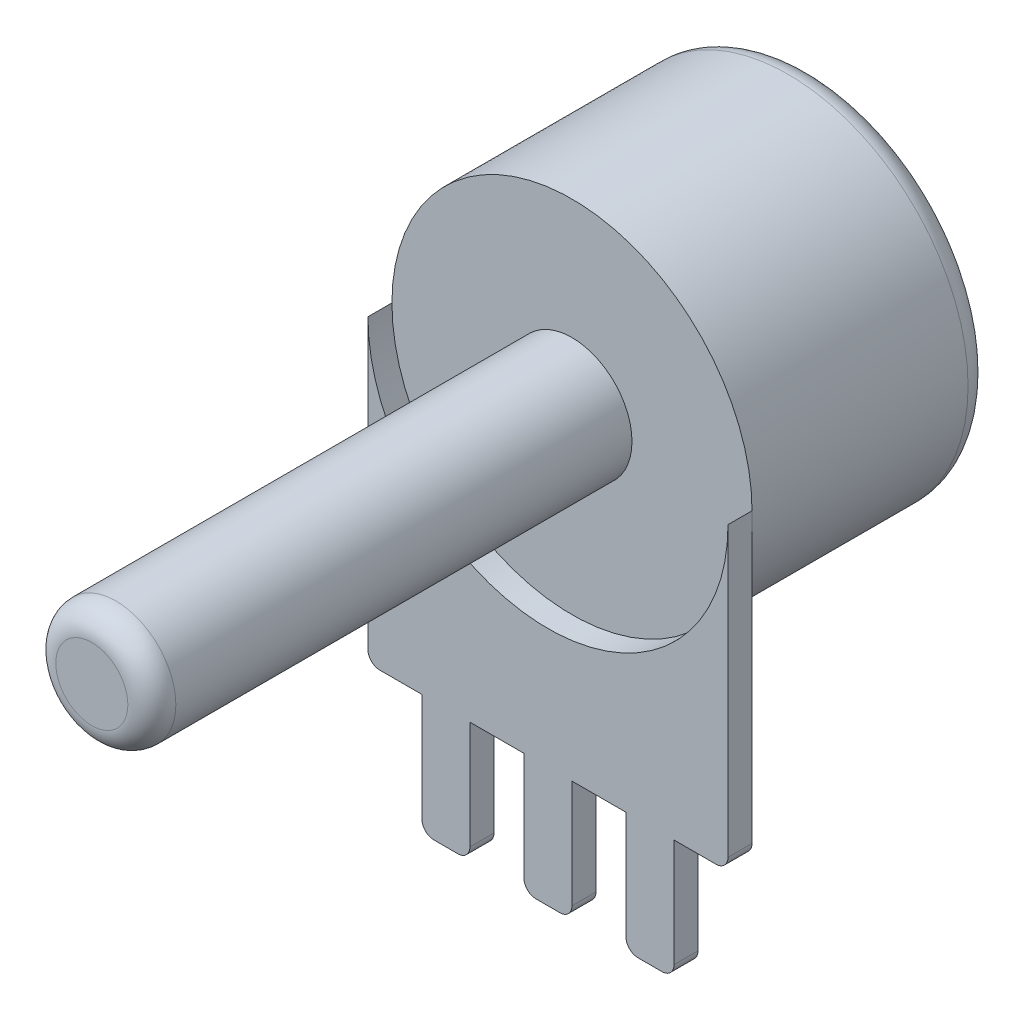
ISO-10303-21;
HEADER;
FILE_DESCRIPTION(('STEP AP214'),'2;1');
FILE_NAME('part.step','',(''),(''),'','','');
FILE_SCHEMA(('AUTOMOTIVE_DESIGN { 1 0 10303 214 1 1 1 1 }'));
ENDSEC;
DATA;
#1=APPLICATION_CONTEXT('core data for automotive mechanical design processes');
#2=APPLICATION_PROTOCOL_DEFINITION('international standard','automotive_design',2000,#1);
#3=PRODUCT_CONTEXT('',#1,'mechanical');
#4=PRODUCT('Part','Part','',(#3));
#5=PRODUCT_RELATED_PRODUCT_CATEGORY('part','',(#4));
#6=PRODUCT_DEFINITION_FORMATION('','',#4);
#7=PRODUCT_DEFINITION_CONTEXT('part definition',#1,'design');
#8=PRODUCT_DEFINITION('design','',#6,#7);
#9=PRODUCT_DEFINITION_SHAPE('','',#8);
#10=(LENGTH_UNIT() NAMED_UNIT(*) SI_UNIT(.MILLI.,.METRE.));
#11=(NAMED_UNIT(*) PLANE_ANGLE_UNIT() SI_UNIT($,.RADIAN.));
#12=(NAMED_UNIT(*) SI_UNIT($,.STERADIAN.) SOLID_ANGLE_UNIT());
#13=UNCERTAINTY_MEASURE_WITH_UNIT(LENGTH_MEASURE(1.E-05),#10,'distance_accuracy_value','');
#14=(GEOMETRIC_REPRESENTATION_CONTEXT(3) GLOBAL_UNCERTAINTY_ASSIGNED_CONTEXT((#13)) GLOBAL_UNIT_ASSIGNED_CONTEXT((#10,
#11,#12)) REPRESENTATION_CONTEXT('',''));
#15=CARTESIAN_POINT('',(0.,0.,0.));
#16=DIRECTION('',(0.,0.,1.));
#17=DIRECTION('',(1.,0.,0.));
#18=AXIS2_PLACEMENT_3D('',#15,#16,#17);
#19=CARTESIAN_POINT('',(0.,0.,11.));
#20=DIRECTION('',(0.,0.,-1.));
#21=DIRECTION('',(-1.,0.,0.));
#22=AXIS2_PLACEMENT_3D('',#19,#20,#21);
#23=CYLINDRICAL_SURFACE('',#22,7.5);
#24=CARTESIAN_POINT('',(0.,0.,10.));
#25=DIRECTION('',(0.,0.,-1.));
#26=DIRECTION('',(1.,0.,0.));
#27=AXIS2_PLACEMENT_3D('',#24,#25,#26);
#28=CIRCLE('',#27,7.5);
#29=CARTESIAN_POINT('',(7.5,0.,10.));
#30=VERTEX_POINT('',#29);
#31=CARTESIAN_POINT('',(-7.5,0.,10.));
#32=VERTEX_POINT('',#31);
#33=EDGE_CURVE('E231',#30,#32,#28,.T.);
#34=ORIENTED_EDGE('',*,*,#33,.T.);
#35=DIRECTION('',(0.,0.,-1.));
#36=VECTOR('',#35,1.);
#37=CARTESIAN_POINT('',(-7.5,0.,11.));
#38=LINE('',#37,#36);
#39=CARTESIAN_POINT('',(-7.5,0.,11.));
#40=VERTEX_POINT('',#39);
#41=EDGE_CURVE('E214',#40,#32,#38,.T.);
#42=ORIENTED_EDGE('',*,*,#41,.F.);
#43=CARTESIAN_POINT('',(0.,0.,11.));
#44=DIRECTION('',(0.,0.,-1.));
#45=DIRECTION('',(1.,0.,0.));
#46=AXIS2_PLACEMENT_3D('',#43,#44,#45);
#47=CIRCLE('',#46,7.5);
#48=CARTESIAN_POINT('',(7.5,0.,11.));
#49=VERTEX_POINT('',#48);
#50=EDGE_CURVE('E220',#49,#40,#47,.T.);
#51=ORIENTED_EDGE('',*,*,#50,.F.);
#52=DIRECTION('',(0.,0.,-1.));
#53=VECTOR('',#52,1.);
#54=CARTESIAN_POINT('',(7.5,0.,11.));
#55=LINE('',#54,#53);
#56=EDGE_CURVE('E362',#49,#30,#55,.T.);
#57=ORIENTED_EDGE('',*,*,#56,.T.);
#58=EDGE_LOOP('',(#34,#42,#51,#57));
#59=FACE_BOUND('',#58,.T.);
#60=ADVANCED_FACE('F47',(#59),#23,.F.);
#61=CARTESIAN_POINT('',(-7.5,-7.5,11.));
#62=DIRECTION('',(1.,0.,0.));
#63=DIRECTION('',(0.,1.,0.));
#64=AXIS2_PLACEMENT_3D('',#61,#62,#63);
#65=PLANE('',#64);
#66=DIRECTION('',(0.,-1.,0.));
#67=VECTOR('',#66,1.);
#68=CARTESIAN_POINT('',(-7.5,-7.5,10.));
#69=LINE('',#68,#67);
#70=CARTESIAN_POINT('',(-7.5,-12.,10.));
#71=VERTEX_POINT('',#70);
#72=EDGE_CURVE('E406',#32,#71,#69,.T.);
#73=ORIENTED_EDGE('',*,*,#72,.T.);
#74=DIRECTION('',(0.,0.,-1.));
#75=VECTOR('',#74,1.);
#76=CARTESIAN_POINT('',(-7.5,-12.,11.));
#77=LINE('',#76,#75);
#78=CARTESIAN_POINT('',(-7.5,-12.,11.));
#79=VERTEX_POINT('',#78);
#80=EDGE_CURVE('E217',#71,#79,#77,.F.);
#81=ORIENTED_EDGE('',*,*,#80,.T.);
#82=DIRECTION('',(0.,-1.,0.));
#83=VECTOR('',#82,1.);
#84=CARTESIAN_POINT('',(-7.5,0.,11.));
#85=LINE('',#84,#83);
#86=EDGE_CURVE('E209',#40,#79,#85,.T.);
#87=ORIENTED_EDGE('',*,*,#86,.F.);
#88=ORIENTED_EDGE('',*,*,#41,.T.);
#89=EDGE_LOOP('',(#73,#81,#87,#88));
#90=FACE_BOUND('',#89,.T.);
#91=ADVANCED_FACE('F212',(#90),#65,.F.);
#92=CARTESIAN_POINT('',(-7.5,-12.5,11.));
#93=DIRECTION('',(0.,1.,0.));
#94=DIRECTION('',(0.,0.,1.));
#95=AXIS2_PLACEMENT_3D('',#92,#93,#94);
#96=PLANE('',#95);
#97=DIRECTION('',(1.,0.,0.));
#98=VECTOR('',#97,1.);
#99=CARTESIAN_POINT('',(-7.5,-12.5,11.));
#100=LINE('',#99,#98);
#101=CARTESIAN_POINT('',(-7.,-12.5,11.));
#102=VERTEX_POINT('',#101);
#103=CARTESIAN_POINT('',(-5.25,-12.5,11.));
#104=VERTEX_POINT('',#103);
#105=EDGE_CURVE('E219',#102,#104,#100,.T.);
#106=ORIENTED_EDGE('',*,*,#105,.F.);
#107=DIRECTION('',(0.,0.,-1.));
#108=VECTOR('',#107,1.);
#109=CARTESIAN_POINT('',(-7.,-12.5,11.));
#110=LINE('',#109,#108);
#111=CARTESIAN_POINT('',(-7.,-12.5,10.));
#112=VERTEX_POINT('',#111);
#113=EDGE_CURVE('E232',#102,#112,#110,.T.);
#114=ORIENTED_EDGE('',*,*,#113,.T.);
#115=DIRECTION('',(1.,0.,0.));
#116=VECTOR('',#115,1.);
#117=CARTESIAN_POINT('',(-7.5,-12.5,10.));
#118=LINE('',#117,#116);
#119=CARTESIAN_POINT('',(-5.25,-12.5,10.));
#120=VERTEX_POINT('',#119);
#121=EDGE_CURVE('E408',#112,#120,#118,.T.);
#122=ORIENTED_EDGE('',*,*,#121,.T.);
#123=DIRECTION('',(0.,0.,-1.));
#124=VECTOR('',#123,1.);
#125=CARTESIAN_POINT('',(-5.25,-12.5,11.));
#126=LINE('',#125,#124);
#127=EDGE_CURVE('E233',#104,#120,#126,.T.);
#128=ORIENTED_EDGE('',*,*,#127,.F.);
#129=EDGE_LOOP('',(#106,#114,#122,#128));
#130=FACE_BOUND('',#129,.T.);
#131=ADVANCED_FACE('F427',(#130),#96,.F.);
#132=CARTESIAN_POINT('',(-5.25,-12.5,11.));
#133=DIRECTION('',(1.,0.,0.));
#134=DIRECTION('',(0.,1.,0.));
#135=AXIS2_PLACEMENT_3D('',#132,#133,#134);
#136=PLANE('',#135);
#137=DIRECTION('',(0.,-1.,0.));
#138=VECTOR('',#137,1.);
#139=CARTESIAN_POINT('',(-5.25,-12.5,10.));
#140=LINE('',#139,#138);
#141=CARTESIAN_POINT('',(-5.25,-17.,10.));
#142=VERTEX_POINT('',#141);
#143=EDGE_CURVE('E338',#120,#142,#140,.T.);
#144=ORIENTED_EDGE('',*,*,#143,.T.);
#145=DIRECTION('',(0.,0.,-1.));
#146=VECTOR('',#145,1.);
#147=CARTESIAN_POINT('',(-5.25,-17.,11.));
#148=LINE('',#147,#146);
#149=CARTESIAN_POINT('',(-5.25,-17.,11.));
#150=VERTEX_POINT('',#149);
#151=EDGE_CURVE('E12',#142,#150,#148,.F.);
#152=ORIENTED_EDGE('',*,*,#151,.T.);
#153=DIRECTION('',(0.,-1.,0.));
#154=VECTOR('',#153,1.);
#155=CARTESIAN_POINT('',(-5.25,-12.5,11.));
#156=LINE('',#155,#154);
#157=EDGE_CURVE('E319',#104,#150,#156,.T.);
#158=ORIENTED_EDGE('',*,*,#157,.F.);
#159=ORIENTED_EDGE('',*,*,#127,.T.);
#160=EDGE_LOOP('',(#144,#152,#158,#159));
#161=FACE_BOUND('',#160,.T.);
#162=ADVANCED_FACE('F413',(#161),#136,.F.);
#163=CARTESIAN_POINT('',(-5.25,-17.5,11.));
#164=DIRECTION('',(0.,1.,0.));
#165=DIRECTION('',(0.,0.,1.));
#166=AXIS2_PLACEMENT_3D('',#163,#164,#165);
#167=PLANE('',#166);
#168=DIRECTION('',(1.,0.,0.));
#169=VECTOR('',#168,1.);
#170=CARTESIAN_POINT('',(-5.25,-17.5,10.));
#171=LINE('',#170,#169);
#172=CARTESIAN_POINT('',(-4.75,-17.5,10.));
#173=VERTEX_POINT('',#172);
#174=CARTESIAN_POINT('',(-3.75,-17.5,10.));
#175=VERTEX_POINT('',#174);
#176=EDGE_CURVE('E312',#173,#175,#171,.T.);
#177=ORIENTED_EDGE('',*,*,#176,.T.);
#178=DIRECTION('',(0.,0.,-1.));
#179=VECTOR('',#178,1.);
#180=CARTESIAN_POINT('',(-3.75,-17.5,11.));
#181=LINE('',#180,#179);
#182=CARTESIAN_POINT('',(-3.75,-17.5,11.));
#183=VERTEX_POINT('',#182);
#184=EDGE_CURVE('E55',#175,#183,#181,.F.);
#185=ORIENTED_EDGE('',*,*,#184,.T.);
#186=DIRECTION('',(1.,0.,0.));
#187=VECTOR('',#186,1.);
#188=CARTESIAN_POINT('',(-5.25,-17.5,11.));
#189=LINE('',#188,#187);
#190=CARTESIAN_POINT('',(-4.75,-17.5,11.));
#191=VERTEX_POINT('',#190);
#192=EDGE_CURVE('E309',#191,#183,#189,.T.);
#193=ORIENTED_EDGE('',*,*,#192,.F.);
#194=DIRECTION('',(0.,0.,-1.));
#195=VECTOR('',#194,1.);
#196=CARTESIAN_POINT('',(-4.75,-17.5,11.));
#197=LINE('',#196,#195);
#198=EDGE_CURVE('E301',#191,#173,#197,.T.);
#199=ORIENTED_EDGE('',*,*,#198,.T.);
#200=EDGE_LOOP('',(#177,#185,#193,#199));
#201=FACE_BOUND('',#200,.T.);
#202=ADVANCED_FACE('F308',(#201),#167,.F.);
#203=CARTESIAN_POINT('',(-3.25,-17.5,11.));
#204=DIRECTION('',(-1.,0.,0.));
#205=DIRECTION('',(0.,-1.,0.));
#206=AXIS2_PLACEMENT_3D('',#203,#204,#205);
#207=PLANE('',#206);
#208=DIRECTION('',(0.,1.,0.));
#209=VECTOR('',#208,1.);
#210=CARTESIAN_POINT('',(-3.25,-17.5,11.));
#211=LINE('',#210,#209);
#212=CARTESIAN_POINT('',(-3.25,-17.,11.));
#213=VERTEX_POINT('',#212);
#214=CARTESIAN_POINT('',(-3.25,-12.5,11.));
#215=VERTEX_POINT('',#214);
#216=EDGE_CURVE('E318',#213,#215,#211,.T.);
#217=ORIENTED_EDGE('',*,*,#216,.F.);
#218=DIRECTION('',(0.,0.,-1.));
#219=VECTOR('',#218,1.);
#220=CARTESIAN_POINT('',(-3.25,-17.,11.));
#221=LINE('',#220,#219);
#222=CARTESIAN_POINT('',(-3.25,-17.,10.));
#223=VERTEX_POINT('',#222);
#224=EDGE_CURVE('E298',#213,#223,#221,.T.);
#225=ORIENTED_EDGE('',*,*,#224,.T.);
#226=DIRECTION('',(0.,1.,0.));
#227=VECTOR('',#226,1.);
#228=CARTESIAN_POINT('',(-3.25,-17.5,10.));
#229=LINE('',#228,#227);
#230=CARTESIAN_POINT('',(-3.25,-12.5,10.));
#231=VERTEX_POINT('',#230);
#232=EDGE_CURVE('E327',#223,#231,#229,.T.);
#233=ORIENTED_EDGE('',*,*,#232,.T.);
#234=DIRECTION('',(0.,0.,-1.));
#235=VECTOR('',#234,1.);
#236=CARTESIAN_POINT('',(-3.25,-12.5,11.));
#237=LINE('',#236,#235);
#238=EDGE_CURVE('E239',#215,#231,#237,.T.);
#239=ORIENTED_EDGE('',*,*,#238,.F.);
#240=EDGE_LOOP('',(#217,#225,#233,#239));
#241=FACE_BOUND('',#240,.T.);
#242=ADVANCED_FACE('F325',(#241),#207,.F.);
#243=CARTESIAN_POINT('',(-3.25,-12.5,11.));
#244=DIRECTION('',(0.,1.,0.));
#245=DIRECTION('',(0.,0.,1.));
#246=AXIS2_PLACEMENT_3D('',#243,#244,#245);
#247=PLANE('',#246);
#248=DIRECTION('',(1.,0.,0.));
#249=VECTOR('',#248,1.);
#250=CARTESIAN_POINT('',(-3.25,-12.5,10.));
#251=LINE('',#250,#249);
#252=CARTESIAN_POINT('',(-0.999999999999999,-12.5,10.));
#253=VERTEX_POINT('',#252);
#254=EDGE_CURVE('E334',#231,#253,#251,.T.);
#255=ORIENTED_EDGE('',*,*,#254,.T.);
#256=DIRECTION('',(0.,0.,-1.));
#257=VECTOR('',#256,1.);
#258=CARTESIAN_POINT('',(-0.999999999999999,-12.5,11.));
#259=LINE('',#258,#257);
#260=CARTESIAN_POINT('',(-0.999999999999999,-12.5,11.));
#261=VERTEX_POINT('',#260);
#262=EDGE_CURVE('E373',#261,#253,#259,.T.);
#263=ORIENTED_EDGE('',*,*,#262,.F.);
#264=DIRECTION('',(1.,0.,0.));
#265=VECTOR('',#264,1.);
#266=CARTESIAN_POINT('',(-3.25,-12.5,11.));
#267=LINE('',#266,#265);
#268=EDGE_CURVE('E379',#215,#261,#267,.T.);
#269=ORIENTED_EDGE('',*,*,#268,.F.);
#270=ORIENTED_EDGE('',*,*,#238,.T.);
#271=EDGE_LOOP('',(#255,#263,#269,#270));
#272=FACE_BOUND('',#271,.T.);
#273=ADVANCED_FACE('F377',(#272),#247,.F.);
#274=CARTESIAN_POINT('',(-0.999999999999999,-12.5,11.));
#275=DIRECTION('',(1.,0.,0.));
#276=DIRECTION('',(0.,1.,0.));
#277=AXIS2_PLACEMENT_3D('',#274,#275,#276);
#278=PLANE('',#277);
#279=DIRECTION('',(0.,-1.,0.));
#280=VECTOR('',#279,1.);
#281=CARTESIAN_POINT('',(-0.999999999999999,-12.5,10.));
#282=LINE('',#281,#280);
#283=CARTESIAN_POINT('',(-0.999999999999998,-17.,10.));
#284=VERTEX_POINT('',#283);
#285=EDGE_CURVE('E336',#253,#284,#282,.T.);
#286=ORIENTED_EDGE('',*,*,#285,.T.);
#287=DIRECTION('',(0.,0.,-1.));
#288=VECTOR('',#287,1.);
#289=CARTESIAN_POINT('',(-0.999999999999998,-17.,11.));
#290=LINE('',#289,#288);
#291=CARTESIAN_POINT('',(-0.999999999999998,-17.,11.));
#292=VERTEX_POINT('',#291);
#293=EDGE_CURVE('E296',#284,#292,#290,.F.);
#294=ORIENTED_EDGE('',*,*,#293,.T.);
#295=DIRECTION('',(0.,-1.,0.));
#296=VECTOR('',#295,1.);
#297=CARTESIAN_POINT('',(-0.999999999999999,-12.5,11.));
#298=LINE('',#297,#296);
#299=EDGE_CURVE('E382',#261,#292,#298,.T.);
#300=ORIENTED_EDGE('',*,*,#299,.F.);
#301=ORIENTED_EDGE('',*,*,#262,.T.);
#302=EDGE_LOOP('',(#286,#294,#300,#301));
#303=FACE_BOUND('',#302,.T.);
#304=ADVANCED_FACE('F515',(#303),#278,.F.);
#305=CARTESIAN_POINT('',(-0.999999999999997,-17.5,11.));
#306=DIRECTION('',(0.,1.,0.));
#307=DIRECTION('',(0.,0.,1.));
#308=AXIS2_PLACEMENT_3D('',#305,#306,#307);
#309=PLANE('',#308);
#310=DIRECTION('',(1.,0.,0.));
#311=VECTOR('',#310,1.);
#312=CARTESIAN_POINT('',(-0.999999999999997,-17.5,10.));
#313=LINE('',#312,#311);
#314=CARTESIAN_POINT('',(-0.499999999999998,-17.5,10.));
#315=VERTEX_POINT('',#314);
#316=CARTESIAN_POINT('',(0.500000000000003,-17.5,10.));
#317=VERTEX_POINT('',#316);
#318=EDGE_CURVE('E344',#315,#317,#313,.T.);
#319=ORIENTED_EDGE('',*,*,#318,.T.);
#320=DIRECTION('',(0.,0.,-1.));
#321=VECTOR('',#320,1.);
#322=CARTESIAN_POINT('',(0.500000000000003,-17.5,11.));
#323=LINE('',#322,#321);
#324=CARTESIAN_POINT('',(0.500000000000003,-17.5,11.));
#325=VERTEX_POINT('',#324);
#326=EDGE_CURVE('E294',#317,#325,#323,.F.);
#327=ORIENTED_EDGE('',*,*,#326,.T.);
#328=DIRECTION('',(1.,0.,0.));
#329=VECTOR('',#328,1.);
#330=CARTESIAN_POINT('',(-0.999999999999997,-17.5,11.));
#331=LINE('',#330,#329);
#332=CARTESIAN_POINT('',(-0.499999999999998,-17.5,11.));
#333=VERTEX_POINT('',#332);
#334=EDGE_CURVE('E384',#333,#325,#331,.T.);
#335=ORIENTED_EDGE('',*,*,#334,.F.);
#336=DIRECTION('',(0.,0.,-1.));
#337=VECTOR('',#336,1.);
#338=CARTESIAN_POINT('',(-0.499999999999998,-17.5,11.));
#339=LINE('',#338,#337);
#340=EDGE_CURVE('E291',#333,#315,#339,.T.);
#341=ORIENTED_EDGE('',*,*,#340,.T.);
#342=EDGE_LOOP('',(#319,#327,#335,#341));
#343=FACE_BOUND('',#342,.T.);
#344=ADVANCED_FACE('F461',(#343),#309,.F.);
#345=CARTESIAN_POINT('',(1.,-17.5,11.));
#346=DIRECTION('',(-1.,0.,0.));
#347=DIRECTION('',(0.,-1.,0.));
#348=AXIS2_PLACEMENT_3D('',#345,#346,#347);
#349=PLANE('',#348);
#350=DIRECTION('',(0.,1.,0.));
#351=VECTOR('',#350,1.);
#352=CARTESIAN_POINT('',(1.,-17.5,11.));
#353=LINE('',#352,#351);
#354=CARTESIAN_POINT('',(1.,-17.,11.));
#355=VERTEX_POINT('',#354);
#356=CARTESIAN_POINT('',(1.,-12.5,11.));
#357=VERTEX_POINT('',#356);
#358=EDGE_CURVE('E390',#355,#357,#353,.T.);
#359=ORIENTED_EDGE('',*,*,#358,.F.);
#360=DIRECTION('',(0.,0.,-1.));
#361=VECTOR('',#360,1.);
#362=CARTESIAN_POINT('',(1.,-17.,11.));
#363=LINE('',#362,#361);
#364=CARTESIAN_POINT('',(1.,-17.,10.));
#365=VERTEX_POINT('',#364);
#366=EDGE_CURVE('E288',#355,#365,#363,.T.);
#367=ORIENTED_EDGE('',*,*,#366,.T.);
#368=DIRECTION('',(0.,1.,0.));
#369=VECTOR('',#368,1.);
#370=CARTESIAN_POINT('',(1.,-17.5,10.));
#371=LINE('',#370,#369);
#372=CARTESIAN_POINT('',(1.,-12.5,10.));
#373=VERTEX_POINT('',#372);
#374=EDGE_CURVE('E347',#365,#373,#371,.T.);
#375=ORIENTED_EDGE('',*,*,#374,.T.);
#376=DIRECTION('',(0.,0.,-1.));
#377=VECTOR('',#376,1.);
#378=CARTESIAN_POINT('',(1.,-12.5,11.));
#379=LINE('',#378,#377);
#380=EDGE_CURVE('E370',#357,#373,#379,.T.);
#381=ORIENTED_EDGE('',*,*,#380,.F.);
#382=EDGE_LOOP('',(#359,#367,#375,#381));
#383=FACE_BOUND('',#382,.T.);
#384=ADVANCED_FACE('F468',(#383),#349,.F.);
#385=CARTESIAN_POINT('',(1.,-12.5,11.));
#386=DIRECTION('',(0.,1.,0.));
#387=DIRECTION('',(0.,0.,1.));
#388=AXIS2_PLACEMENT_3D('',#385,#386,#387);
#389=PLANE('',#388);
#390=DIRECTION('',(1.,0.,0.));
#391=VECTOR('',#390,1.);
#392=CARTESIAN_POINT('',(1.,-12.5,10.));
#393=LINE('',#392,#391);
#394=CARTESIAN_POINT('',(3.25,-12.5,10.));
#395=VERTEX_POINT('',#394);
#396=EDGE_CURVE('E349',#373,#395,#393,.T.);
#397=ORIENTED_EDGE('',*,*,#396,.T.);
#398=DIRECTION('',(0.,0.,-1.));
#399=VECTOR('',#398,1.);
#400=CARTESIAN_POINT('',(3.25,-12.5,11.));
#401=LINE('',#400,#399);
#402=CARTESIAN_POINT('',(3.25,-12.5,11.));
#403=VERTEX_POINT('',#402);
#404=EDGE_CURVE('E367',#403,#395,#401,.T.);
#405=ORIENTED_EDGE('',*,*,#404,.F.);
#406=DIRECTION('',(1.,0.,0.));
#407=VECTOR('',#406,1.);
#408=CARTESIAN_POINT('',(1.,-12.5,11.));
#409=LINE('',#408,#407);
#410=EDGE_CURVE('E392',#357,#403,#409,.T.);
#411=ORIENTED_EDGE('',*,*,#410,.F.);
#412=ORIENTED_EDGE('',*,*,#380,.T.);
#413=EDGE_LOOP('',(#397,#405,#411,#412));
#414=FACE_BOUND('',#413,.T.);
#415=ADVANCED_FACE('F474',(#414),#389,.F.);
#416=CARTESIAN_POINT('',(3.25,-12.5,11.));
#417=DIRECTION('',(1.,0.,0.));
#418=DIRECTION('',(0.,1.,0.));
#419=AXIS2_PLACEMENT_3D('',#416,#417,#418);
#420=PLANE('',#419);
#421=DIRECTION('',(0.,-1.,0.));
#422=VECTOR('',#421,1.);
#423=CARTESIAN_POINT('',(3.25,-12.5,10.));
#424=LINE('',#423,#422);
#425=CARTESIAN_POINT('',(3.25,-17.,10.));
#426=VERTEX_POINT('',#425);
#427=EDGE_CURVE('E351',#395,#426,#424,.T.);
#428=ORIENTED_EDGE('',*,*,#427,.T.);
#429=DIRECTION('',(0.,0.,-1.));
#430=VECTOR('',#429,1.);
#431=CARTESIAN_POINT('',(3.25,-17.,11.));
#432=LINE('',#431,#430);
#433=CARTESIAN_POINT('',(3.25,-17.,11.));
#434=VERTEX_POINT('',#433);
#435=EDGE_CURVE('E286',#426,#434,#432,.F.);
#436=ORIENTED_EDGE('',*,*,#435,.T.);
#437=DIRECTION('',(0.,-1.,0.));
#438=VECTOR('',#437,1.);
#439=CARTESIAN_POINT('',(3.25,-12.5,11.));
#440=LINE('',#439,#438);
#441=EDGE_CURVE('E394',#403,#434,#440,.T.);
#442=ORIENTED_EDGE('',*,*,#441,.F.);
#443=ORIENTED_EDGE('',*,*,#404,.T.);
#444=EDGE_LOOP('',(#428,#436,#442,#443));
#445=FACE_BOUND('',#444,.T.);
#446=ADVANCED_FACE('F525',(#445),#420,.F.);
#447=CARTESIAN_POINT('',(3.25,-17.5,11.));
#448=DIRECTION('',(0.,1.,0.));
#449=DIRECTION('',(0.,0.,1.));
#450=AXIS2_PLACEMENT_3D('',#447,#448,#449);
#451=PLANE('',#450);
#452=DIRECTION('',(1.,0.,0.));
#453=VECTOR('',#452,1.);
#454=CARTESIAN_POINT('',(3.25,-17.5,10.));
#455=LINE('',#454,#453);
#456=CARTESIAN_POINT('',(3.75,-17.5,10.));
#457=VERTEX_POINT('',#456);
#458=CARTESIAN_POINT('',(4.75,-17.5,10.));
#459=VERTEX_POINT('',#458);
#460=EDGE_CURVE('E354',#457,#459,#455,.T.);
#461=ORIENTED_EDGE('',*,*,#460,.T.);
#462=DIRECTION('',(0.,0.,-1.));
#463=VECTOR('',#462,1.);
#464=CARTESIAN_POINT('',(4.75,-17.5,11.));
#465=LINE('',#464,#463);
#466=CARTESIAN_POINT('',(4.75,-17.5,11.));
#467=VERTEX_POINT('',#466);
#468=EDGE_CURVE('E284',#459,#467,#465,.F.);
#469=ORIENTED_EDGE('',*,*,#468,.T.);
#470=DIRECTION('',(1.,0.,0.));
#471=VECTOR('',#470,1.);
#472=CARTESIAN_POINT('',(3.25,-17.5,11.));
#473=LINE('',#472,#471);
#474=CARTESIAN_POINT('',(3.75,-17.5,11.));
#475=VERTEX_POINT('',#474);
#476=EDGE_CURVE('E397',#475,#467,#473,.T.);
#477=ORIENTED_EDGE('',*,*,#476,.F.);
#478=DIRECTION('',(0.,0.,-1.));
#479=VECTOR('',#478,1.);
#480=CARTESIAN_POINT('',(3.75,-17.5,11.));
#481=LINE('',#480,#479);
#482=EDGE_CURVE('E281',#475,#457,#481,.T.);
#483=ORIENTED_EDGE('',*,*,#482,.T.);
#484=EDGE_LOOP('',(#461,#469,#477,#483));
#485=FACE_BOUND('',#484,.T.);
#486=ADVANCED_FACE('F483',(#485),#451,.F.);
#487=CARTESIAN_POINT('',(5.25,-17.5,11.));
#488=DIRECTION('',(-1.,0.,0.));
#489=DIRECTION('',(0.,-1.,0.));
#490=AXIS2_PLACEMENT_3D('',#487,#488,#489);
#491=PLANE('',#490);
#492=DIRECTION('',(0.,1.,0.));
#493=VECTOR('',#492,1.);
#494=CARTESIAN_POINT('',(5.25,-17.5,11.));
#495=LINE('',#494,#493);
#496=CARTESIAN_POINT('',(5.25,-17.,11.));
#497=VERTEX_POINT('',#496);
#498=CARTESIAN_POINT('',(5.25,-12.5,11.));
#499=VERTEX_POINT('',#498);
#500=EDGE_CURVE('E400',#497,#499,#495,.T.);
#501=ORIENTED_EDGE('',*,*,#500,.F.);
#502=DIRECTION('',(0.,0.,-1.));
#503=VECTOR('',#502,1.);
#504=CARTESIAN_POINT('',(5.25,-17.,11.));
#505=LINE('',#504,#503);
#506=CARTESIAN_POINT('',(5.25,-17.,10.));
#507=VERTEX_POINT('',#506);
#508=EDGE_CURVE('E278',#497,#507,#505,.T.);
#509=ORIENTED_EDGE('',*,*,#508,.T.);
#510=DIRECTION('',(0.,1.,0.));
#511=VECTOR('',#510,1.);
#512=CARTESIAN_POINT('',(5.25,-17.5,10.));
#513=LINE('',#512,#511);
#514=CARTESIAN_POINT('',(5.25,-12.5,10.));
#515=VERTEX_POINT('',#514);
#516=EDGE_CURVE('E357',#507,#515,#513,.T.);
#517=ORIENTED_EDGE('',*,*,#516,.T.);
#518=DIRECTION('',(0.,0.,-1.));
#519=VECTOR('',#518,1.);
#520=CARTESIAN_POINT('',(5.25,-12.5,11.));
#521=LINE('',#520,#519);
#522=EDGE_CURVE('E364',#499,#515,#521,.T.);
#523=ORIENTED_EDGE('',*,*,#522,.F.);
#524=EDGE_LOOP('',(#501,#509,#517,#523));
#525=FACE_BOUND('',#524,.T.);
#526=ADVANCED_FACE('F492',(#525),#491,.F.);
#527=CARTESIAN_POINT('',(5.25,-12.5,11.));
#528=DIRECTION('',(0.,1.,0.));
#529=DIRECTION('',(0.,0.,1.));
#530=AXIS2_PLACEMENT_3D('',#527,#528,#529);
#531=PLANE('',#530);
#532=DIRECTION('',(1.,0.,0.));
#533=VECTOR('',#532,1.);
#534=CARTESIAN_POINT('',(5.25,-12.5,10.));
#535=LINE('',#534,#533);
#536=CARTESIAN_POINT('',(7.,-12.5,10.));
#537=VERTEX_POINT('',#536);
#538=EDGE_CURVE('E359',#515,#537,#535,.T.);
#539=ORIENTED_EDGE('',*,*,#538,.T.);
#540=DIRECTION('',(0.,0.,-1.));
#541=VECTOR('',#540,1.);
#542=CARTESIAN_POINT('',(7.,-12.5,11.));
#543=LINE('',#542,#541);
#544=CARTESIAN_POINT('',(7.,-12.5,11.));
#545=VERTEX_POINT('',#544);
#546=EDGE_CURVE('E70',#537,#545,#543,.F.);
#547=ORIENTED_EDGE('',*,*,#546,.T.);
#548=DIRECTION('',(1.,0.,0.));
#549=VECTOR('',#548,1.);
#550=CARTESIAN_POINT('',(5.25,-12.5,11.));
#551=LINE('',#550,#549);
#552=EDGE_CURVE('E402',#499,#545,#551,.T.);
#553=ORIENTED_EDGE('',*,*,#552,.F.);
#554=ORIENTED_EDGE('',*,*,#522,.T.);
#555=EDGE_LOOP('',(#539,#547,#553,#554));
#556=FACE_BOUND('',#555,.T.);
#557=ADVANCED_FACE('F532',(#556),#531,.F.);
#558=CARTESIAN_POINT('',(7.5,-7.5,11.));
#559=DIRECTION('',(-1.,0.,0.));
#560=DIRECTION('',(0.,-1.,0.));
#561=AXIS2_PLACEMENT_3D('',#558,#559,#560);
#562=PLANE('',#561);
#563=DIRECTION('',(0.,1.,0.));
#564=VECTOR('',#563,1.);
#565=CARTESIAN_POINT('',(7.5,-12.5,11.));
#566=LINE('',#565,#564);
#567=CARTESIAN_POINT('',(7.5,-12.,11.));
#568=VERTEX_POINT('',#567);
#569=EDGE_CURVE('E224',#568,#49,#566,.T.);
#570=ORIENTED_EDGE('',*,*,#569,.F.);
#571=DIRECTION('',(0.,0.,-1.));
#572=VECTOR('',#571,1.);
#573=CARTESIAN_POINT('',(7.5,-12.,11.));
#574=LINE('',#573,#572);
#575=CARTESIAN_POINT('',(7.5,-12.,10.));
#576=VERTEX_POINT('',#575);
#577=EDGE_CURVE('E274',#568,#576,#574,.T.);
#578=ORIENTED_EDGE('',*,*,#577,.T.);
#579=DIRECTION('',(0.,1.,0.));
#580=VECTOR('',#579,1.);
#581=CARTESIAN_POINT('',(7.5,-7.5,10.));
#582=LINE('',#581,#580);
#583=EDGE_CURVE('E228',#576,#30,#582,.T.);
#584=ORIENTED_EDGE('',*,*,#583,.T.);
#585=ORIENTED_EDGE('',*,*,#56,.F.);
#586=EDGE_LOOP('',(#570,#578,#584,#585));
#587=FACE_BOUND('',#586,.T.);
#588=ADVANCED_FACE('F497',(#587),#562,.F.);
#589=CARTESIAN_POINT('',(0.,0.,11.));
#590=DIRECTION('',(0.,0.,1.));
#591=DIRECTION('',(1.,0.,0.));
#592=AXIS2_PLACEMENT_3D('',#589,#590,#591);
#593=PLANE('',#592);
#594=ORIENTED_EDGE('',*,*,#86,.T.);
#595=CARTESIAN_POINT('',(-7.,-12.,11.));
#596=DIRECTION('',(0.,0.,1.));
#597=DIRECTION('',(1.,0.,0.));
#598=AXIS2_PLACEMENT_3D('',#595,#596,#597);
#599=CIRCLE('',#598,0.5);
#600=EDGE_CURVE('E272',#79,#102,#599,.T.);
#601=ORIENTED_EDGE('',*,*,#600,.T.);
#602=ORIENTED_EDGE('',*,*,#105,.T.);
#603=ORIENTED_EDGE('',*,*,#157,.T.);
#604=CARTESIAN_POINT('',(-4.75,-17.,11.));
#605=DIRECTION('',(0.,0.,1.));
#606=DIRECTION('',(1.,0.,0.));
#607=AXIS2_PLACEMENT_3D('',#604,#605,#606);
#608=CIRCLE('',#607,0.5);
#609=EDGE_CURVE('E259',#150,#191,#608,.T.);
#610=ORIENTED_EDGE('',*,*,#609,.T.);
#611=ORIENTED_EDGE('',*,*,#192,.T.);
#612=CARTESIAN_POINT('',(-3.75,-17.,11.));
#613=DIRECTION('',(0.,0.,1.));
#614=DIRECTION('',(1.,0.,0.));
#615=AXIS2_PLACEMENT_3D('',#612,#613,#614);
#616=CIRCLE('',#615,0.5);
#617=EDGE_CURVE('E261',#183,#213,#616,.T.);
#618=ORIENTED_EDGE('',*,*,#617,.T.);
#619=ORIENTED_EDGE('',*,*,#216,.T.);
#620=ORIENTED_EDGE('',*,*,#268,.T.);
#621=ORIENTED_EDGE('',*,*,#299,.T.);
#622=CARTESIAN_POINT('',(-0.499999999999998,-17.,11.));
#623=DIRECTION('',(0.,0.,1.));
#624=DIRECTION('',(1.,0.,0.));
#625=AXIS2_PLACEMENT_3D('',#622,#623,#624);
#626=CIRCLE('',#625,0.5);
#627=EDGE_CURVE('E263',#292,#333,#626,.T.);
#628=ORIENTED_EDGE('',*,*,#627,.T.);
#629=ORIENTED_EDGE('',*,*,#334,.T.);
#630=CARTESIAN_POINT('',(0.500000000000003,-17.,11.));
#631=DIRECTION('',(0.,0.,1.));
#632=DIRECTION('',(1.,0.,0.));
#633=AXIS2_PLACEMENT_3D('',#630,#631,#632);
#634=CIRCLE('',#633,0.5);
#635=EDGE_CURVE('E265',#325,#355,#634,.T.);
#636=ORIENTED_EDGE('',*,*,#635,.T.);
#637=ORIENTED_EDGE('',*,*,#358,.T.);
#638=ORIENTED_EDGE('',*,*,#410,.T.);
#639=ORIENTED_EDGE('',*,*,#441,.T.);
#640=CARTESIAN_POINT('',(3.75,-17.,11.));
#641=DIRECTION('',(0.,0.,1.));
#642=DIRECTION('',(1.,0.,0.));
#643=AXIS2_PLACEMENT_3D('',#640,#641,#642);
#644=CIRCLE('',#643,0.5);
#645=EDGE_CURVE('E267',#434,#475,#644,.T.);
#646=ORIENTED_EDGE('',*,*,#645,.T.);
#647=ORIENTED_EDGE('',*,*,#476,.T.);
#648=CARTESIAN_POINT('',(4.75,-17.,11.));
#649=DIRECTION('',(0.,0.,1.));
#650=DIRECTION('',(1.,0.,0.));
#651=AXIS2_PLACEMENT_3D('',#648,#649,#650);
#652=CIRCLE('',#651,0.5);
#653=EDGE_CURVE('E269',#467,#497,#652,.T.);
#654=ORIENTED_EDGE('',*,*,#653,.T.);
#655=ORIENTED_EDGE('',*,*,#500,.T.);
#656=ORIENTED_EDGE('',*,*,#552,.T.);
#657=CARTESIAN_POINT('',(7.,-12.,11.));
#658=DIRECTION('',(0.,0.,1.));
#659=DIRECTION('',(1.,0.,0.));
#660=AXIS2_PLACEMENT_3D('',#657,#658,#659);
#661=CIRCLE('',#660,0.5);
#662=EDGE_CURVE('E62',#545,#568,#661,.T.);
#663=ORIENTED_EDGE('',*,*,#662,.T.);
#664=ORIENTED_EDGE('',*,*,#569,.T.);
#665=ORIENTED_EDGE('',*,*,#50,.T.);
#666=EDGE_LOOP('',(#594,#601,#602,#603,#610,#611,#618,#619,#620,#621,#628,#629,#636,#637,#638,
#639,#646,#647,#654,#655,#656,#663,#664,#665));
#667=FACE_BOUND('',#666,.T.);
#668=ADVANCED_FACE('F223',(#667),#593,.T.);
#669=CARTESIAN_POINT('',(0.,0.,10.));
#670=DIRECTION('',(0.,0.,1.));
#671=DIRECTION('',(1.,0.,0.));
#672=AXIS2_PLACEMENT_3D('',#669,#670,#671);
#673=PLANE('',#672);
#674=ORIENTED_EDGE('',*,*,#121,.F.);
#675=CARTESIAN_POINT('',(-7.,-12.,10.));
#676=DIRECTION('',(0.,0.,1.));
#677=DIRECTION('',(1.,0.,0.));
#678=AXIS2_PLACEMENT_3D('',#675,#676,#677);
#679=CIRCLE('',#678,0.5);
#680=EDGE_CURVE('E256',#112,#71,#679,.F.);
#681=ORIENTED_EDGE('',*,*,#680,.T.);
#682=ORIENTED_EDGE('',*,*,#72,.F.);
#683=ORIENTED_EDGE('',*,*,#33,.F.);
#684=ORIENTED_EDGE('',*,*,#583,.F.);
#685=CARTESIAN_POINT('',(7.,-12.,10.));
#686=DIRECTION('',(0.,0.,1.));
#687=DIRECTION('',(1.,0.,0.));
#688=AXIS2_PLACEMENT_3D('',#685,#686,#687);
#689=CIRCLE('',#688,0.5);
#690=EDGE_CURVE('E254',#576,#537,#689,.F.);
#691=ORIENTED_EDGE('',*,*,#690,.T.);
#692=ORIENTED_EDGE('',*,*,#538,.F.);
#693=ORIENTED_EDGE('',*,*,#516,.F.);
#694=CARTESIAN_POINT('',(4.75,-17.,10.));
#695=DIRECTION('',(0.,0.,1.));
#696=DIRECTION('',(1.,0.,0.));
#697=AXIS2_PLACEMENT_3D('',#694,#695,#696);
#698=CIRCLE('',#697,0.5);
#699=EDGE_CURVE('E252',#507,#459,#698,.F.);
#700=ORIENTED_EDGE('',*,*,#699,.T.);
#701=ORIENTED_EDGE('',*,*,#460,.F.);
#702=CARTESIAN_POINT('',(3.75,-17.,10.));
#703=DIRECTION('',(0.,0.,1.));
#704=DIRECTION('',(1.,0.,0.));
#705=AXIS2_PLACEMENT_3D('',#702,#703,#704);
#706=CIRCLE('',#705,0.5);
#707=EDGE_CURVE('E250',#457,#426,#706,.F.);
#708=ORIENTED_EDGE('',*,*,#707,.T.);
#709=ORIENTED_EDGE('',*,*,#427,.F.);
#710=ORIENTED_EDGE('',*,*,#396,.F.);
#711=ORIENTED_EDGE('',*,*,#374,.F.);
#712=CARTESIAN_POINT('',(0.500000000000003,-17.,10.));
#713=DIRECTION('',(0.,0.,1.));
#714=DIRECTION('',(1.,0.,0.));
#715=AXIS2_PLACEMENT_3D('',#712,#713,#714);
#716=CIRCLE('',#715,0.5);
#717=EDGE_CURVE('E248',#365,#317,#716,.F.);
#718=ORIENTED_EDGE('',*,*,#717,.T.);
#719=ORIENTED_EDGE('',*,*,#318,.F.);
#720=CARTESIAN_POINT('',(-0.499999999999998,-17.,10.));
#721=DIRECTION('',(0.,0.,1.));
#722=DIRECTION('',(1.,0.,0.));
#723=AXIS2_PLACEMENT_3D('',#720,#721,#722);
#724=CIRCLE('',#723,0.5);
#725=EDGE_CURVE('E246',#315,#284,#724,.F.);
#726=ORIENTED_EDGE('',*,*,#725,.T.);
#727=ORIENTED_EDGE('',*,*,#285,.F.);
#728=ORIENTED_EDGE('',*,*,#254,.F.);
#729=ORIENTED_EDGE('',*,*,#232,.F.);
#730=CARTESIAN_POINT('',(-3.75,-17.,10.));
#731=DIRECTION('',(0.,0.,1.));
#732=DIRECTION('',(1.,0.,0.));
#733=AXIS2_PLACEMENT_3D('',#730,#731,#732);
#734=CIRCLE('',#733,0.5);
#735=EDGE_CURVE('E244',#223,#175,#734,.F.);
#736=ORIENTED_EDGE('',*,*,#735,.T.);
#737=ORIENTED_EDGE('',*,*,#176,.F.);
#738=CARTESIAN_POINT('',(-4.75,-17.,10.));
#739=DIRECTION('',(0.,0.,1.));
#740=DIRECTION('',(1.,0.,0.));
#741=AXIS2_PLACEMENT_3D('',#738,#739,#740);
#742=CIRCLE('',#741,0.5);
#743=EDGE_CURVE('E236',#173,#142,#742,.F.);
#744=ORIENTED_EDGE('',*,*,#743,.T.);
#745=ORIENTED_EDGE('',*,*,#143,.F.);
#746=EDGE_LOOP('',(#674,#681,#682,#683,#684,#691,#692,#693,#700,#701,#708,#709,#710,#711,#718,
#719,#726,#727,#728,#729,#736,#737,#744,#745));
#747=FACE_BOUND('',#746,.T.);
#748=ADVANCED_FACE('F332',(#747),#673,.F.);
#749=CARTESIAN_POINT('',(-7.,-12.,11.));
#750=DIRECTION('',(0.,0.,-1.));
#751=DIRECTION('',(-1.,0.,0.));
#752=AXIS2_PLACEMENT_3D('',#749,#750,#751);
#753=CYLINDRICAL_SURFACE('',#752,0.5);
#754=ORIENTED_EDGE('',*,*,#600,.F.);
#755=ORIENTED_EDGE('',*,*,#80,.F.);
#756=ORIENTED_EDGE('',*,*,#680,.F.);
#757=ORIENTED_EDGE('',*,*,#113,.F.);
#758=EDGE_LOOP('',(#754,#755,#756,#757));
#759=FACE_BOUND('',#758,.T.);
#760=ADVANCED_FACE('F431',(#759),#753,.T.);
#761=CARTESIAN_POINT('',(7.,-12.,11.));
#762=DIRECTION('',(0.,0.,-1.));
#763=DIRECTION('',(-1.,0.,0.));
#764=AXIS2_PLACEMENT_3D('',#761,#762,#763);
#765=CYLINDRICAL_SURFACE('',#764,0.5);
#766=ORIENTED_EDGE('',*,*,#662,.F.);
#767=ORIENTED_EDGE('',*,*,#546,.F.);
#768=ORIENTED_EDGE('',*,*,#690,.F.);
#769=ORIENTED_EDGE('',*,*,#577,.F.);
#770=EDGE_LOOP('',(#766,#767,#768,#769));
#771=FACE_BOUND('',#770,.T.);
#772=ADVANCED_FACE('F434',(#771),#765,.T.);
#773=CARTESIAN_POINT('',(4.75,-17.,11.));
#774=DIRECTION('',(0.,0.,-1.));
#775=DIRECTION('',(-1.,0.,0.));
#776=AXIS2_PLACEMENT_3D('',#773,#774,#775);
#777=CYLINDRICAL_SURFACE('',#776,0.5);
#778=ORIENTED_EDGE('',*,*,#653,.F.);
#779=ORIENTED_EDGE('',*,*,#468,.F.);
#780=ORIENTED_EDGE('',*,*,#699,.F.);
#781=ORIENTED_EDGE('',*,*,#508,.F.);
#782=EDGE_LOOP('',(#778,#779,#780,#781));
#783=FACE_BOUND('',#782,.T.);
#784=ADVANCED_FACE('F438',(#783),#777,.T.);
#785=CARTESIAN_POINT('',(3.75,-17.,11.));
#786=DIRECTION('',(0.,0.,-1.));
#787=DIRECTION('',(-1.,0.,0.));
#788=AXIS2_PLACEMENT_3D('',#785,#786,#787);
#789=CYLINDRICAL_SURFACE('',#788,0.5);
#790=ORIENTED_EDGE('',*,*,#645,.F.);
#791=ORIENTED_EDGE('',*,*,#435,.F.);
#792=ORIENTED_EDGE('',*,*,#707,.F.);
#793=ORIENTED_EDGE('',*,*,#482,.F.);
#794=EDGE_LOOP('',(#790,#791,#792,#793));
#795=FACE_BOUND('',#794,.T.);
#796=ADVANCED_FACE('F442',(#795),#789,.T.);
#797=CARTESIAN_POINT('',(0.500000000000003,-17.,11.));
#798=DIRECTION('',(0.,0.,-1.));
#799=DIRECTION('',(-1.,0.,0.));
#800=AXIS2_PLACEMENT_3D('',#797,#798,#799);
#801=CYLINDRICAL_SURFACE('',#800,0.5);
#802=ORIENTED_EDGE('',*,*,#635,.F.);
#803=ORIENTED_EDGE('',*,*,#326,.F.);
#804=ORIENTED_EDGE('',*,*,#717,.F.);
#805=ORIENTED_EDGE('',*,*,#366,.F.);
#806=EDGE_LOOP('',(#802,#803,#804,#805));
#807=FACE_BOUND('',#806,.T.);
#808=ADVANCED_FACE('F446',(#807),#801,.T.);
#809=CARTESIAN_POINT('',(-0.499999999999998,-17.,11.));
#810=DIRECTION('',(0.,0.,-1.));
#811=DIRECTION('',(-1.,0.,0.));
#812=AXIS2_PLACEMENT_3D('',#809,#810,#811);
#813=CYLINDRICAL_SURFACE('',#812,0.5);
#814=ORIENTED_EDGE('',*,*,#627,.F.);
#815=ORIENTED_EDGE('',*,*,#293,.F.);
#816=ORIENTED_EDGE('',*,*,#725,.F.);
#817=ORIENTED_EDGE('',*,*,#340,.F.);
#818=EDGE_LOOP('',(#814,#815,#816,#817));
#819=FACE_BOUND('',#818,.T.);
#820=ADVANCED_FACE('F421',(#819),#813,.T.);
#821=CARTESIAN_POINT('',(-3.75,-17.,11.));
#822=DIRECTION('',(0.,0.,-1.));
#823=DIRECTION('',(-1.,0.,0.));
#824=AXIS2_PLACEMENT_3D('',#821,#822,#823);
#825=CYLINDRICAL_SURFACE('',#824,0.5);
#826=ORIENTED_EDGE('',*,*,#617,.F.);
#827=ORIENTED_EDGE('',*,*,#184,.F.);
#828=ORIENTED_EDGE('',*,*,#735,.F.);
#829=ORIENTED_EDGE('',*,*,#224,.F.);
#830=EDGE_LOOP('',(#826,#827,#828,#829));
#831=FACE_BOUND('',#830,.T.);
#832=ADVANCED_FACE('F322',(#831),#825,.T.);
#833=CARTESIAN_POINT('',(-4.75,-17.,11.));
#834=DIRECTION('',(0.,0.,-1.));
#835=DIRECTION('',(-1.,0.,0.));
#836=AXIS2_PLACEMENT_3D('',#833,#834,#835);
#837=CYLINDRICAL_SURFACE('',#836,0.5);
#838=ORIENTED_EDGE('',*,*,#609,.F.);
#839=ORIENTED_EDGE('',*,*,#151,.F.);
#840=ORIENTED_EDGE('',*,*,#743,.F.);
#841=ORIENTED_EDGE('',*,*,#198,.F.);
#842=EDGE_LOOP('',(#838,#839,#840,#841));
#843=FACE_BOUND('',#842,.T.);
#844=ADVANCED_FACE('F49',(#843),#837,.T.);
#845=CLOSED_SHELL('',(#60,#91,#131,#162,#202,#242,#273,#304,#344,#384,#415,#446,#486,#526,#557,
#588,#668,#748,#760,#772,#784,#796,#808,#820,#832,#844));
#846=MANIFOLD_SOLID_BREP('B2',#845);
#847=CARTESIAN_POINT('',(0.,0.,10.));
#848=DIRECTION('',(0.,0.,-1.));
#849=DIRECTION('',(-1.,0.,0.));
#850=AXIS2_PLACEMENT_3D('',#847,#848,#849);
#851=CYLINDRICAL_SURFACE('',#850,7.5);
#852=CARTESIAN_POINT('',(0.,0.,0.999999999999999));
#853=DIRECTION('',(0.,0.,1.));
#854=DIRECTION('',(1.,0.,0.));
#855=AXIS2_PLACEMENT_3D('',#852,#853,#854);
#856=CIRCLE('',#855,7.5);
#857=CARTESIAN_POINT('',(7.5,0.,0.999999999999999));
#858=VERTEX_POINT('',#857);
#859=EDGE_CURVE('E715',#858,#858,#856,.T.);
#860=ORIENTED_EDGE('',*,*,#859,.T.);
#861=EDGE_LOOP('',(#860));
#862=FACE_BOUND('',#861,.T.);
#863=CARTESIAN_POINT('',(0.,0.,10.));
#864=DIRECTION('',(0.,0.,1.));
#865=DIRECTION('',(1.,0.,0.));
#866=AXIS2_PLACEMENT_3D('',#863,#864,#865);
#867=CIRCLE('',#866,7.5);
#868=CARTESIAN_POINT('',(7.5,0.,10.));
#869=VERTEX_POINT('',#868);
#870=EDGE_CURVE('E722',#869,#869,#867,.T.);
#871=ORIENTED_EDGE('',*,*,#870,.F.);
#872=EDGE_LOOP('',(#871));
#873=FACE_BOUND('',#872,.T.);
#874=ADVANCED_FACE('F697',(#862,#873),#851,.T.);
#875=CARTESIAN_POINT('',(0.,0.,10.));
#876=DIRECTION('',(0.,0.,1.));
#877=DIRECTION('',(1.,0.,0.));
#878=AXIS2_PLACEMENT_3D('',#875,#876,#877);
#879=PLANE('',#878);
#880=CARTESIAN_POINT('',(0.,0.,10.));
#881=DIRECTION('',(0.,0.,1.));
#882=DIRECTION('',(1.,0.,0.));
#883=AXIS2_PLACEMENT_3D('',#880,#881,#882);
#884=CIRCLE('',#883,2.5);
#885=CARTESIAN_POINT('',(2.5,0.,10.));
#886=VERTEX_POINT('',#885);
#887=EDGE_CURVE('E721',#886,#886,#884,.T.);
#888=ORIENTED_EDGE('',*,*,#887,.F.);
#889=EDGE_LOOP('',(#888));
#890=FACE_BOUND('',#889,.T.);
#891=ORIENTED_EDGE('',*,*,#870,.T.);
#892=EDGE_LOOP('',(#891));
#893=FACE_BOUND('',#892,.T.);
#894=ADVANCED_FACE('F732',(#890,#893),#879,.T.);
#895=CARTESIAN_POINT('',(0.,0.,0.));
#896=DIRECTION('',(0.,0.,1.));
#897=DIRECTION('',(1.,0.,0.));
#898=AXIS2_PLACEMENT_3D('',#895,#896,#897);
#899=PLANE('',#898);
#900=CARTESIAN_POINT('',(0.,0.,0.));
#901=DIRECTION('',(0.,0.,1.));
#902=DIRECTION('',(1.,0.,0.));
#903=AXIS2_PLACEMENT_3D('',#900,#901,#902);
#904=CIRCLE('',#903,6.5);
#905=CARTESIAN_POINT('',(6.5,0.,0.));
#906=VERTEX_POINT('',#905);
#907=EDGE_CURVE('E710',#906,#906,#904,.F.);
#908=ORIENTED_EDGE('',*,*,#907,.T.);
#909=EDGE_LOOP('',(#908));
#910=FACE_BOUND('',#909,.T.);
#911=ADVANCED_FACE('F735',(#910),#899,.F.);
#912=CARTESIAN_POINT('',(0.,0.,30.));
#913=DIRECTION('',(0.,0.,-1.));
#914=DIRECTION('',(-1.,0.,0.));
#915=AXIS2_PLACEMENT_3D('',#912,#913,#914);
#916=CYLINDRICAL_SURFACE('',#915,2.5);
#917=CARTESIAN_POINT('',(0.,0.,29.));
#918=DIRECTION('',(0.,0.,1.));
#919=DIRECTION('',(1.,0.,0.));
#920=AXIS2_PLACEMENT_3D('',#917,#918,#919);
#921=CIRCLE('',#920,2.5);
#922=CARTESIAN_POINT('',(2.5,0.,29.));
#923=VERTEX_POINT('',#922);
#924=EDGE_CURVE('E46',#923,#923,#921,.F.);
#925=ORIENTED_EDGE('',*,*,#924,.T.);
#926=EDGE_LOOP('',(#925));
#927=FACE_BOUND('',#926,.T.);
#928=ORIENTED_EDGE('',*,*,#887,.T.);
#929=EDGE_LOOP('',(#928));
#930=FACE_BOUND('',#929,.T.);
#931=ADVANCED_FACE('F730',(#927,#930),#916,.T.);
#932=CARTESIAN_POINT('',(0.,0.,30.));
#933=DIRECTION('',(0.,0.,1.));
#934=DIRECTION('',(1.,0.,0.));
#935=AXIS2_PLACEMENT_3D('',#932,#933,#934);
#936=PLANE('',#935);
#937=CARTESIAN_POINT('',(0.,0.,30.));
#938=DIRECTION('',(0.,0.,1.));
#939=DIRECTION('',(1.,0.,0.));
#940=AXIS2_PLACEMENT_3D('',#937,#938,#939);
#941=CIRCLE('',#940,1.5);
#942=CARTESIAN_POINT('',(1.5,0.,30.));
#943=VERTEX_POINT('',#942);
#944=EDGE_CURVE('E705',#943,#943,#941,.T.);
#945=ORIENTED_EDGE('',*,*,#944,.T.);
#946=EDGE_LOOP('',(#945));
#947=FACE_BOUND('',#946,.T.);
#948=ADVANCED_FACE('F747',(#947),#936,.T.);
#949=CARTESIAN_POINT('',(0.,0.,0.999999999999999));
#950=DIRECTION('',(0.,0.,1.));
#951=DIRECTION('',(1.,0.,0.));
#952=AXIS2_PLACEMENT_3D('',#949,#950,#951);
#953=TOROIDAL_SURFACE('',#952,6.5,1.);
#954=ORIENTED_EDGE('',*,*,#907,.F.);
#955=EDGE_LOOP('',(#954));
#956=FACE_BOUND('',#955,.T.);
#957=ORIENTED_EDGE('',*,*,#859,.F.);
#958=EDGE_LOOP('',(#957));
#959=FACE_BOUND('',#958,.T.);
#960=ADVANCED_FACE('F745',(#956,#959),#953,.T.);
#961=CARTESIAN_POINT('',(0.,0.,29.));
#962=DIRECTION('',(0.,0.,1.));
#963=DIRECTION('',(1.,0.,0.));
#964=AXIS2_PLACEMENT_3D('',#961,#962,#963);
#965=TOROIDAL_SURFACE('',#964,1.5,1.);
#966=ORIENTED_EDGE('',*,*,#924,.F.);
#967=EDGE_LOOP('',(#966));
#968=FACE_BOUND('',#967,.T.);
#969=ORIENTED_EDGE('',*,*,#944,.F.);
#970=EDGE_LOOP('',(#969));
#971=FACE_BOUND('',#970,.T.);
#972=ADVANCED_FACE('F699',(#968,#971),#965,.T.);
#973=CLOSED_SHELL('',(#874,#894,#911,#931,#948,#960,#972));
#974=MANIFOLD_SOLID_BREP('B6',#973);
#975=ADVANCED_BREP_SHAPE_REPRESENTATION('',(#18,#846,#974),#14);
#976=SHAPE_DEFINITION_REPRESENTATION(#9,#975);
ENDSEC;
END-ISO-10303-21;
